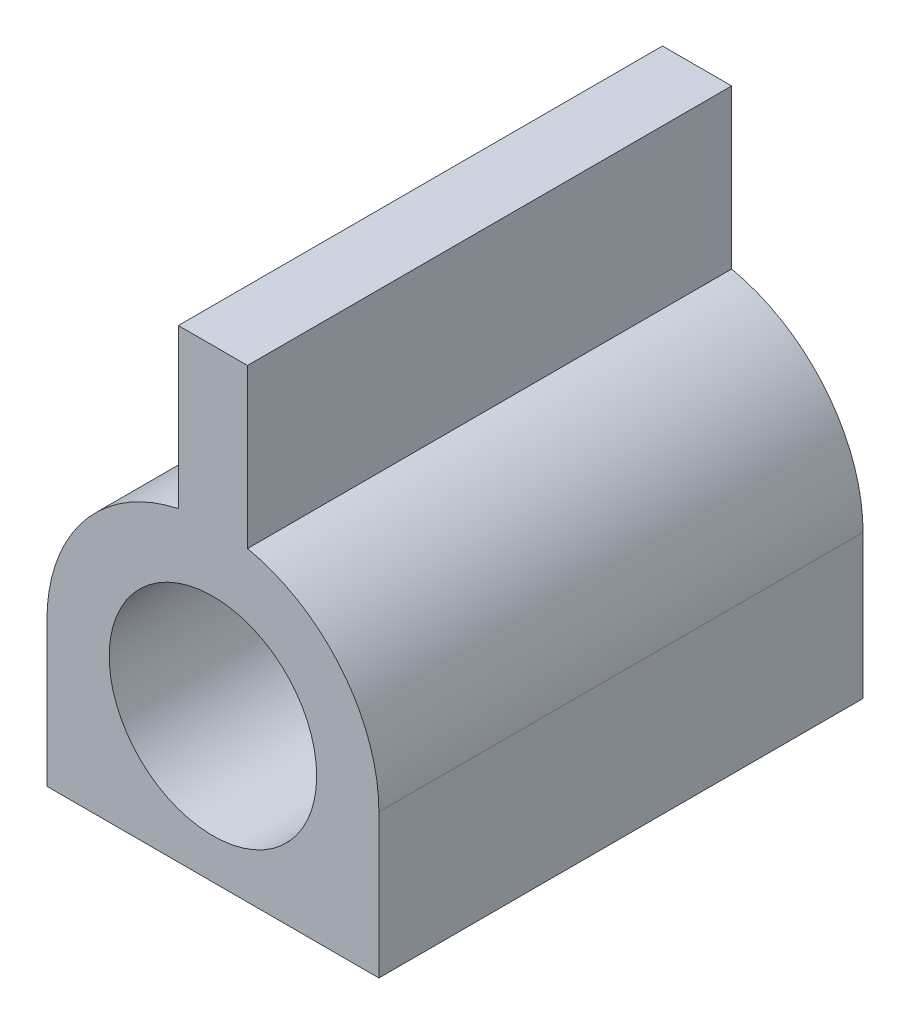
ISO-10303-21;
HEADER;
FILE_DESCRIPTION(('STEP AP214'),'2;1');
FILE_NAME('part.step','',(''),(''),'','','');
FILE_SCHEMA(('AUTOMOTIVE_DESIGN { 1 0 10303 214 1 1 1 1 }'));
ENDSEC;
DATA;
#1=APPLICATION_CONTEXT('core data for automotive mechanical design processes');
#2=APPLICATION_PROTOCOL_DEFINITION('international standard','automotive_design',2000,#1);
#3=PRODUCT_CONTEXT('',#1,'mechanical');
#4=PRODUCT('Part','Part','',(#3));
#5=PRODUCT_RELATED_PRODUCT_CATEGORY('part','',(#4));
#6=PRODUCT_DEFINITION_FORMATION('','',#4);
#7=PRODUCT_DEFINITION_CONTEXT('part definition',#1,'design');
#8=PRODUCT_DEFINITION('design','',#6,#7);
#9=PRODUCT_DEFINITION_SHAPE('','',#8);
#10=(LENGTH_UNIT() NAMED_UNIT(*) SI_UNIT(.MILLI.,.METRE.));
#11=(NAMED_UNIT(*) PLANE_ANGLE_UNIT() SI_UNIT($,.RADIAN.));
#12=(NAMED_UNIT(*) SI_UNIT($,.STERADIAN.) SOLID_ANGLE_UNIT());
#13=UNCERTAINTY_MEASURE_WITH_UNIT(LENGTH_MEASURE(1.E-05),#10,'distance_accuracy_value','');
#14=(GEOMETRIC_REPRESENTATION_CONTEXT(3) GLOBAL_UNCERTAINTY_ASSIGNED_CONTEXT((#13)) GLOBAL_UNIT_ASSIGNED_CONTEXT((#10,
#11,#12)) REPRESENTATION_CONTEXT('',''));
#15=CARTESIAN_POINT('',(0.,0.,0.));
#16=DIRECTION('',(0.,0.,1.));
#17=DIRECTION('',(1.,0.,0.));
#18=AXIS2_PLACEMENT_3D('',#15,#16,#17);
#19=CARTESIAN_POINT('',(0.,0.,22.225));
#20=DIRECTION('',(0.,0.,-1.));
#21=DIRECTION('',(-1.,0.,0.));
#22=AXIS2_PLACEMENT_3D('',#19,#20,#21);
#23=PLANE('',#22);
#24=DIRECTION('',(0.,-1.,0.));
#25=VECTOR('',#24,1.);
#26=CARTESIAN_POINT('',(-15.24,-13.208,22.225));
#27=LINE('',#26,#25);
#28=CARTESIAN_POINT('',(-15.24,0.,22.225));
#29=VERTEX_POINT('',#28);
#30=CARTESIAN_POINT('',(-15.24,-13.208,22.225));
#31=VERTEX_POINT('',#30);
#32=EDGE_CURVE('E146',#29,#31,#27,.T.);
#33=ORIENTED_EDGE('',*,*,#32,.T.);
#34=DIRECTION('',(1.,0.,0.));
#35=VECTOR('',#34,1.);
#36=CARTESIAN_POINT('',(15.24,-13.208,22.225));
#37=LINE('',#36,#35);
#38=CARTESIAN_POINT('',(15.24,-13.208,22.225));
#39=VERTEX_POINT('',#38);
#40=EDGE_CURVE('E94',#31,#39,#37,.T.);
#41=ORIENTED_EDGE('',*,*,#40,.T.);
#42=DIRECTION('',(0.,1.,0.));
#43=VECTOR('',#42,1.);
#44=CARTESIAN_POINT('',(15.24,0.,22.225));
#45=LINE('',#44,#43);
#46=CARTESIAN_POINT('',(15.24,0.,22.225));
#47=VERTEX_POINT('',#46);
#48=EDGE_CURVE('E161',#39,#47,#45,.T.);
#49=ORIENTED_EDGE('',*,*,#48,.T.);
#50=CARTESIAN_POINT('',(0.,0.,22.225));
#51=DIRECTION('',(0.,0.,1.));
#52=DIRECTION('',(-1.,0.,0.));
#53=AXIS2_PLACEMENT_3D('',#50,#51,#52);
#54=CIRCLE('',#53,15.24);
#55=CARTESIAN_POINT('',(3.175,14.905602134768,22.225));
#56=VERTEX_POINT('',#55);
#57=EDGE_CURVE('E174',#47,#56,#54,.T.);
#58=ORIENTED_EDGE('',*,*,#57,.T.);
#59=DIRECTION('',(0.,1.,0.));
#60=VECTOR('',#59,1.);
#61=CARTESIAN_POINT('',(3.175,29.464,22.225));
#62=LINE('',#61,#60);
#63=CARTESIAN_POINT('',(3.175,29.464,22.225));
#64=VERTEX_POINT('',#63);
#65=EDGE_CURVE('E113',#56,#64,#62,.T.);
#66=ORIENTED_EDGE('',*,*,#65,.T.);
#67=DIRECTION('',(-1.,0.,0.));
#68=VECTOR('',#67,1.);
#69=CARTESIAN_POINT('',(-3.175,29.464,22.225));
#70=LINE('',#69,#68);
#71=CARTESIAN_POINT('',(-3.175,29.464,22.225));
#72=VERTEX_POINT('',#71);
#73=EDGE_CURVE('E107',#64,#72,#70,.T.);
#74=ORIENTED_EDGE('',*,*,#73,.T.);
#75=DIRECTION('',(0.,-1.,0.));
#76=VECTOR('',#75,1.);
#77=CARTESIAN_POINT('',(-3.175,14.905602134768,22.225));
#78=LINE('',#77,#76);
#79=CARTESIAN_POINT('',(-3.175,14.905602134768,22.225));
#80=VERTEX_POINT('',#79);
#81=EDGE_CURVE('E111',#72,#80,#78,.T.);
#82=ORIENTED_EDGE('',*,*,#81,.T.);
#83=CARTESIAN_POINT('',(0.,0.,22.225));
#84=DIRECTION('',(0.,0.,1.));
#85=DIRECTION('',(-1.,0.,0.));
#86=AXIS2_PLACEMENT_3D('',#83,#84,#85);
#87=CIRCLE('',#86,15.24);
#88=EDGE_CURVE('E51',#80,#29,#87,.T.);
#89=ORIENTED_EDGE('',*,*,#88,.T.);
#90=EDGE_LOOP('',(#33,#41,#49,#58,#66,#74,#82,#89));
#91=FACE_BOUND('',#90,.T.);
#92=CARTESIAN_POINT('',(0.,0.,22.225));
#93=DIRECTION('',(0.,0.,1.));
#94=DIRECTION('',(1.,0.,0.));
#95=AXIS2_PLACEMENT_3D('',#92,#93,#94);
#96=CIRCLE('',#95,9.525);
#97=CARTESIAN_POINT('',(9.525,0.,22.225));
#98=VERTEX_POINT('',#97);
#99=EDGE_CURVE('E135',#98,#98,#96,.T.);
#100=ORIENTED_EDGE('',*,*,#99,.F.);
#101=EDGE_LOOP('',(#100));
#102=FACE_BOUND('',#101,.T.);
#103=ADVANCED_FACE('F34',(#91,#102),#23,.F.);
#104=CARTESIAN_POINT('',(0.,0.,-22.225));
#105=DIRECTION('',(0.,0.,-1.));
#106=DIRECTION('',(-1.,0.,0.));
#107=AXIS2_PLACEMENT_3D('',#104,#105,#106);
#108=PLANE('',#107);
#109=DIRECTION('',(0.,-1.,0.));
#110=VECTOR('',#109,1.);
#111=CARTESIAN_POINT('',(-15.24,-13.208,-22.225));
#112=LINE('',#111,#110);
#113=CARTESIAN_POINT('',(-15.24,0.,-22.225));
#114=VERTEX_POINT('',#113);
#115=CARTESIAN_POINT('',(-15.24,-13.208,-22.225));
#116=VERTEX_POINT('',#115);
#117=EDGE_CURVE('E131',#114,#116,#112,.T.);
#118=ORIENTED_EDGE('',*,*,#117,.F.);
#119=CARTESIAN_POINT('',(0.,0.,-22.225));
#120=DIRECTION('',(0.,0.,1.));
#121=DIRECTION('',(-1.,0.,0.));
#122=AXIS2_PLACEMENT_3D('',#119,#120,#121);
#123=CIRCLE('',#122,15.24);
#124=CARTESIAN_POINT('',(-3.175,14.905602134768,-22.225));
#125=VERTEX_POINT('',#124);
#126=EDGE_CURVE('E86',#125,#114,#123,.T.);
#127=ORIENTED_EDGE('',*,*,#126,.F.);
#128=DIRECTION('',(0.,-1.,0.));
#129=VECTOR('',#128,1.);
#130=CARTESIAN_POINT('',(-3.175,14.905602134768,-22.225));
#131=LINE('',#130,#129);
#132=CARTESIAN_POINT('',(-3.175,29.464,-22.225));
#133=VERTEX_POINT('',#132);
#134=EDGE_CURVE('E80',#133,#125,#131,.T.);
#135=ORIENTED_EDGE('',*,*,#134,.F.);
#136=DIRECTION('',(-1.,0.,0.));
#137=VECTOR('',#136,1.);
#138=CARTESIAN_POINT('',(-3.175,29.464,-22.225));
#139=LINE('',#138,#137);
#140=CARTESIAN_POINT('',(3.175,29.464,-22.225));
#141=VERTEX_POINT('',#140);
#142=EDGE_CURVE('E121',#141,#133,#139,.T.);
#143=ORIENTED_EDGE('',*,*,#142,.F.);
#144=DIRECTION('',(0.,1.,0.));
#145=VECTOR('',#144,1.);
#146=CARTESIAN_POINT('',(3.175,29.464,-22.225));
#147=LINE('',#146,#145);
#148=CARTESIAN_POINT('',(3.175,14.905602134768,-22.225));
#149=VERTEX_POINT('',#148);
#150=EDGE_CURVE('E141',#149,#141,#147,.T.);
#151=ORIENTED_EDGE('',*,*,#150,.F.);
#152=CARTESIAN_POINT('',(0.,0.,-22.225));
#153=DIRECTION('',(0.,0.,1.));
#154=DIRECTION('',(-1.,0.,0.));
#155=AXIS2_PLACEMENT_3D('',#152,#153,#154);
#156=CIRCLE('',#155,15.24);
#157=CARTESIAN_POINT('',(15.24,0.,-22.225));
#158=VERTEX_POINT('',#157);
#159=EDGE_CURVE('E139',#158,#149,#156,.T.);
#160=ORIENTED_EDGE('',*,*,#159,.F.);
#161=DIRECTION('',(0.,1.,0.));
#162=VECTOR('',#161,1.);
#163=CARTESIAN_POINT('',(15.24,0.,-22.225));
#164=LINE('',#163,#162);
#165=CARTESIAN_POINT('',(15.24,-13.208,-22.225));
#166=VERTEX_POINT('',#165);
#167=EDGE_CURVE('E137',#166,#158,#164,.T.);
#168=ORIENTED_EDGE('',*,*,#167,.F.);
#169=DIRECTION('',(1.,0.,0.));
#170=VECTOR('',#169,1.);
#171=CARTESIAN_POINT('',(15.24,-13.208,-22.225));
#172=LINE('',#171,#170);
#173=EDGE_CURVE('E134',#116,#166,#172,.T.);
#174=ORIENTED_EDGE('',*,*,#173,.F.);
#175=EDGE_LOOP('',(#118,#127,#135,#143,#151,#160,#168,#174));
#176=FACE_BOUND('',#175,.T.);
#177=CARTESIAN_POINT('',(0.,0.,-22.225));
#178=DIRECTION('',(0.,0.,1.));
#179=DIRECTION('',(1.,0.,0.));
#180=AXIS2_PLACEMENT_3D('',#177,#178,#179);
#181=CIRCLE('',#180,9.525);
#182=CARTESIAN_POINT('',(9.525,0.,-22.225));
#183=VERTEX_POINT('',#182);
#184=EDGE_CURVE('E180',#183,#183,#181,.T.);
#185=ORIENTED_EDGE('',*,*,#184,.T.);
#186=EDGE_LOOP('',(#185));
#187=FACE_BOUND('',#186,.T.);
#188=ADVANCED_FACE('F165',(#176,#187),#108,.T.);
#189=CARTESIAN_POINT('',(-15.24,-13.208,22.225));
#190=DIRECTION('',(1.,0.,0.));
#191=DIRECTION('',(0.,1.,0.));
#192=AXIS2_PLACEMENT_3D('',#189,#190,#191);
#193=PLANE('',#192);
#194=ORIENTED_EDGE('',*,*,#117,.T.);
#195=DIRECTION('',(0.,0.,-1.));
#196=VECTOR('',#195,1.);
#197=CARTESIAN_POINT('',(-15.24,-13.208,22.225));
#198=LINE('',#197,#196);
#199=EDGE_CURVE('E11',#31,#116,#198,.T.);
#200=ORIENTED_EDGE('',*,*,#199,.F.);
#201=ORIENTED_EDGE('',*,*,#32,.F.);
#202=DIRECTION('',(0.,0.,-1.));
#203=VECTOR('',#202,1.);
#204=CARTESIAN_POINT('',(-15.24,0.,22.225));
#205=LINE('',#204,#203);
#206=EDGE_CURVE('E127',#29,#114,#205,.T.);
#207=ORIENTED_EDGE('',*,*,#206,.T.);
#208=EDGE_LOOP('',(#194,#200,#201,#207));
#209=FACE_BOUND('',#208,.T.);
#210=ADVANCED_FACE('F36',(#209),#193,.F.);
#211=CARTESIAN_POINT('',(15.24,-13.208,22.225));
#212=DIRECTION('',(0.,1.,0.));
#213=DIRECTION('',(-1.,0.,0.));
#214=AXIS2_PLACEMENT_3D('',#211,#212,#213);
#215=PLANE('',#214);
#216=ORIENTED_EDGE('',*,*,#173,.T.);
#217=DIRECTION('',(0.,0.,-1.));
#218=VECTOR('',#217,1.);
#219=CARTESIAN_POINT('',(15.24,-13.208,22.225));
#220=LINE('',#219,#218);
#221=EDGE_CURVE('E43',#39,#166,#220,.T.);
#222=ORIENTED_EDGE('',*,*,#221,.F.);
#223=ORIENTED_EDGE('',*,*,#40,.F.);
#224=ORIENTED_EDGE('',*,*,#199,.T.);
#225=EDGE_LOOP('',(#216,#222,#223,#224));
#226=FACE_BOUND('',#225,.T.);
#227=ADVANCED_FACE('F208',(#226),#215,.F.);
#228=CARTESIAN_POINT('',(15.24,0.,22.225));
#229=DIRECTION('',(-1.,0.,0.));
#230=DIRECTION('',(0.,-1.,0.));
#231=AXIS2_PLACEMENT_3D('',#228,#229,#230);
#232=PLANE('',#231);
#233=ORIENTED_EDGE('',*,*,#167,.T.);
#234=DIRECTION('',(0.,0.,-1.));
#235=VECTOR('',#234,1.);
#236=CARTESIAN_POINT('',(15.24,0.,22.225));
#237=LINE('',#236,#235);
#238=EDGE_CURVE('E153',#47,#158,#237,.T.);
#239=ORIENTED_EDGE('',*,*,#238,.F.);
#240=ORIENTED_EDGE('',*,*,#48,.F.);
#241=ORIENTED_EDGE('',*,*,#221,.T.);
#242=EDGE_LOOP('',(#233,#239,#240,#241));
#243=FACE_BOUND('',#242,.T.);
#244=ADVANCED_FACE('F159',(#243),#232,.F.);
#245=CARTESIAN_POINT('',(0.,0.,22.225));
#246=DIRECTION('',(0.,0.,-1.));
#247=DIRECTION('',(-1.,0.,0.));
#248=AXIS2_PLACEMENT_3D('',#245,#246,#247);
#249=CYLINDRICAL_SURFACE('',#248,15.24);
#250=ORIENTED_EDGE('',*,*,#159,.T.);
#251=DIRECTION('',(0.,0.,-1.));
#252=VECTOR('',#251,1.);
#253=CARTESIAN_POINT('',(3.175,14.905602134768,22.225));
#254=LINE('',#253,#252);
#255=EDGE_CURVE('E150',#56,#149,#254,.T.);
#256=ORIENTED_EDGE('',*,*,#255,.F.);
#257=ORIENTED_EDGE('',*,*,#57,.F.);
#258=ORIENTED_EDGE('',*,*,#238,.T.);
#259=EDGE_LOOP('',(#250,#256,#257,#258));
#260=FACE_BOUND('',#259,.T.);
#261=ADVANCED_FACE('F170',(#260),#249,.T.);
#262=CARTESIAN_POINT('',(3.175,29.464,22.225));
#263=DIRECTION('',(-1.,0.,0.));
#264=DIRECTION('',(0.,-1.,0.));
#265=AXIS2_PLACEMENT_3D('',#262,#263,#264);
#266=PLANE('',#265);
#267=ORIENTED_EDGE('',*,*,#150,.T.);
#268=DIRECTION('',(0.,0.,-1.));
#269=VECTOR('',#268,1.);
#270=CARTESIAN_POINT('',(3.175,29.464,22.225));
#271=LINE('',#270,#269);
#272=EDGE_CURVE('E122',#64,#141,#271,.T.);
#273=ORIENTED_EDGE('',*,*,#272,.F.);
#274=ORIENTED_EDGE('',*,*,#65,.F.);
#275=ORIENTED_EDGE('',*,*,#255,.T.);
#276=EDGE_LOOP('',(#267,#273,#274,#275));
#277=FACE_BOUND('',#276,.T.);
#278=ADVANCED_FACE('F173',(#277),#266,.F.);
#279=CARTESIAN_POINT('',(-3.175,29.464,22.225));
#280=DIRECTION('',(0.,-1.,0.));
#281=DIRECTION('',(0.,0.,-1.));
#282=AXIS2_PLACEMENT_3D('',#279,#280,#281);
#283=PLANE('',#282);
#284=ORIENTED_EDGE('',*,*,#142,.T.);
#285=DIRECTION('',(0.,0.,-1.));
#286=VECTOR('',#285,1.);
#287=CARTESIAN_POINT('',(-3.175,29.464,22.225));
#288=LINE('',#287,#286);
#289=EDGE_CURVE('E118',#72,#133,#288,.T.);
#290=ORIENTED_EDGE('',*,*,#289,.F.);
#291=ORIENTED_EDGE('',*,*,#73,.F.);
#292=ORIENTED_EDGE('',*,*,#272,.T.);
#293=EDGE_LOOP('',(#284,#290,#291,#292));
#294=FACE_BOUND('',#293,.T.);
#295=ADVANCED_FACE('F119',(#294),#283,.F.);
#296=CARTESIAN_POINT('',(-3.175,14.905602134768,22.225));
#297=DIRECTION('',(1.,0.,0.));
#298=DIRECTION('',(0.,1.,0.));
#299=AXIS2_PLACEMENT_3D('',#296,#297,#298);
#300=PLANE('',#299);
#301=ORIENTED_EDGE('',*,*,#134,.T.);
#302=DIRECTION('',(0.,0.,-1.));
#303=VECTOR('',#302,1.);
#304=CARTESIAN_POINT('',(-3.175,14.905602134768,22.225));
#305=LINE('',#304,#303);
#306=EDGE_CURVE('E123',#80,#125,#305,.T.);
#307=ORIENTED_EDGE('',*,*,#306,.F.);
#308=ORIENTED_EDGE('',*,*,#81,.F.);
#309=ORIENTED_EDGE('',*,*,#289,.T.);
#310=EDGE_LOOP('',(#301,#307,#308,#309));
#311=FACE_BOUND('',#310,.T.);
#312=ADVANCED_FACE('F125',(#311),#300,.F.);
#313=CARTESIAN_POINT('',(0.,0.,22.225));
#314=DIRECTION('',(0.,0.,-1.));
#315=DIRECTION('',(-1.,0.,0.));
#316=AXIS2_PLACEMENT_3D('',#313,#314,#315);
#317=CYLINDRICAL_SURFACE('',#316,15.24);
#318=ORIENTED_EDGE('',*,*,#126,.T.);
#319=ORIENTED_EDGE('',*,*,#206,.F.);
#320=ORIENTED_EDGE('',*,*,#88,.F.);
#321=ORIENTED_EDGE('',*,*,#306,.T.);
#322=EDGE_LOOP('',(#318,#319,#320,#321));
#323=FACE_BOUND('',#322,.T.);
#324=ADVANCED_FACE('F196',(#323),#317,.T.);
#325=CARTESIAN_POINT('',(0.,0.,22.225));
#326=DIRECTION('',(0.,0.,-1.));
#327=DIRECTION('',(-1.,0.,0.));
#328=AXIS2_PLACEMENT_3D('',#325,#326,#327);
#329=CYLINDRICAL_SURFACE('',#328,9.525);
#330=ORIENTED_EDGE('',*,*,#99,.T.);
#331=EDGE_LOOP('',(#330));
#332=FACE_BOUND('',#331,.T.);
#333=ORIENTED_EDGE('',*,*,#184,.F.);
#334=EDGE_LOOP('',(#333));
#335=FACE_BOUND('',#334,.T.);
#336=ADVANCED_FACE('F186',(#332,#335),#329,.F.);
#337=CLOSED_SHELL('',(#103,#188,#210,#227,#244,#261,#278,#295,#312,#324,#336));
#338=MANIFOLD_SOLID_BREP('B2',#337);
#339=ADVANCED_BREP_SHAPE_REPRESENTATION('',(#18,#338),#14);
#340=SHAPE_DEFINITION_REPRESENTATION(#9,#339);
ENDSEC;
END-ISO-10303-21;
